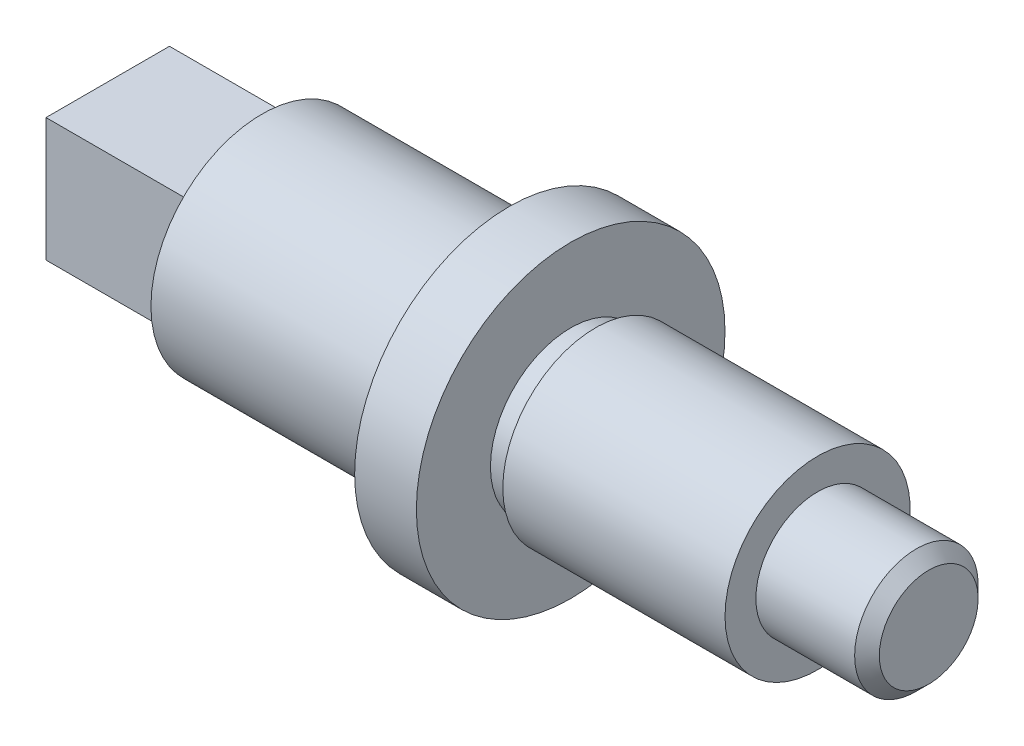
ISO-10303-21;
HEADER;
FILE_DESCRIPTION(('STEP AP214'),'2;1');
FILE_NAME('part.step','',(''),(''),'','','');
FILE_SCHEMA(('AUTOMOTIVE_DESIGN { 1 0 10303 214 1 1 1 1 }'));
ENDSEC;
DATA;
#1=APPLICATION_CONTEXT('core data for automotive mechanical design processes');
#2=APPLICATION_PROTOCOL_DEFINITION('international standard','automotive_design',2000,#1);
#3=PRODUCT_CONTEXT('',#1,'mechanical');
#4=PRODUCT('Part','Part','',(#3));
#5=PRODUCT_RELATED_PRODUCT_CATEGORY('part','',(#4));
#6=PRODUCT_DEFINITION_FORMATION('','',#4);
#7=PRODUCT_DEFINITION_CONTEXT('part definition',#1,'design');
#8=PRODUCT_DEFINITION('design','',#6,#7);
#9=PRODUCT_DEFINITION_SHAPE('','',#8);
#10=(LENGTH_UNIT() NAMED_UNIT(*) SI_UNIT(.MILLI.,.METRE.));
#11=(NAMED_UNIT(*) PLANE_ANGLE_UNIT() SI_UNIT($,.RADIAN.));
#12=(NAMED_UNIT(*) SI_UNIT($,.STERADIAN.) SOLID_ANGLE_UNIT());
#13=UNCERTAINTY_MEASURE_WITH_UNIT(LENGTH_MEASURE(1.E-05),#10,'distance_accuracy_value','');
#14=(GEOMETRIC_REPRESENTATION_CONTEXT(3) GLOBAL_UNCERTAINTY_ASSIGNED_CONTEXT((#13)) GLOBAL_UNIT_ASSIGNED_CONTEXT((#10,
#11,#12)) REPRESENTATION_CONTEXT('',''));
#15=CARTESIAN_POINT('',(0.,0.,0.));
#16=DIRECTION('',(0.,0.,1.));
#17=DIRECTION('',(1.,0.,0.));
#18=AXIS2_PLACEMENT_3D('',#15,#16,#17);
#19=CARTESIAN_POINT('',(18.1873759509063,0.,0.));
#20=DIRECTION('',(-1.,0.,0.));
#21=DIRECTION('',(0.,0.,1.));
#22=AXIS2_PLACEMENT_3D('',#19,#20,#21);
#23=PLANE('',#22);
#24=DIRECTION('',(0.,1.,0.));
#25=VECTOR('',#24,1.);
#26=CARTESIAN_POINT('',(18.1873759509063,10.,10.));
#27=LINE('',#26,#25);
#28=CARTESIAN_POINT('',(18.1873759509063,-10.,10.));
#29=VERTEX_POINT('',#28);
#30=CARTESIAN_POINT('',(18.1873759509063,10.,10.));
#31=VERTEX_POINT('',#30);
#32=EDGE_CURVE('E54',#29,#31,#27,.T.);
#33=ORIENTED_EDGE('',*,*,#32,.F.);
#34=DIRECTION('',(0.,0.,1.));
#35=VECTOR('',#34,1.);
#36=CARTESIAN_POINT('',(18.1873759509063,-10.,-9.99999999999999));
#37=LINE('',#36,#35);
#38=CARTESIAN_POINT('',(18.1873759509063,-10.,-9.99999999999999));
#39=VERTEX_POINT('',#38);
#40=EDGE_CURVE('E58',#39,#29,#37,.T.);
#41=ORIENTED_EDGE('',*,*,#40,.F.);
#42=DIRECTION('',(0.,-1.,0.));
#43=VECTOR('',#42,1.);
#44=CARTESIAN_POINT('',(18.1873759509063,10.,-10.));
#45=LINE('',#44,#43);
#46=CARTESIAN_POINT('',(18.1873759509063,10.,-10.));
#47=VERTEX_POINT('',#46);
#48=EDGE_CURVE('E327',#47,#39,#45,.T.);
#49=ORIENTED_EDGE('',*,*,#48,.F.);
#50=DIRECTION('',(0.,0.,-1.));
#51=VECTOR('',#50,1.);
#52=CARTESIAN_POINT('',(18.1873759509063,10.,-10.));
#53=LINE('',#52,#51);
#54=EDGE_CURVE('E337',#31,#47,#53,.T.);
#55=ORIENTED_EDGE('',*,*,#54,.F.);
#56=EDGE_LOOP('',(#33,#41,#49,#55));
#57=FACE_BOUND('',#56,.T.);
#58=CARTESIAN_POINT('',(18.1873759509063,0.,0.));
#59=DIRECTION('',(-1.,0.,0.));
#60=DIRECTION('',(0.,0.,1.));
#61=AXIS2_PLACEMENT_3D('',#58,#59,#60);
#62=CIRCLE('',#61,18.);
#63=CARTESIAN_POINT('',(18.1873759509063,0.,18.));
#64=VERTEX_POINT('',#63);
#65=EDGE_CURVE('E11',#64,#64,#62,.T.);
#66=ORIENTED_EDGE('',*,*,#65,.T.);
#67=EDGE_LOOP('',(#66));
#68=FACE_BOUND('',#67,.T.);
#69=ADVANCED_FACE('F39',(#57,#68),#23,.T.);
#70=CARTESIAN_POINT('',(0.,0.,0.));
#71=DIRECTION('',(-1.,0.,0.));
#72=DIRECTION('',(0.,0.,1.));
#73=AXIS2_PLACEMENT_3D('',#70,#71,#72);
#74=CYLINDRICAL_SURFACE('',#73,18.);
#75=CARTESIAN_POINT('',(54.1873759509062,0.,0.));
#76=DIRECTION('',(-1.,0.,0.));
#77=DIRECTION('',(0.,0.,1.));
#78=AXIS2_PLACEMENT_3D('',#75,#76,#77);
#79=CIRCLE('',#78,18.);
#80=CARTESIAN_POINT('',(54.1873759509062,0.,18.));
#81=VERTEX_POINT('',#80);
#82=EDGE_CURVE('E47',#81,#81,#79,.T.);
#83=ORIENTED_EDGE('',*,*,#82,.T.);
#84=EDGE_LOOP('',(#83));
#85=FACE_BOUND('',#84,.T.);
#86=ORIENTED_EDGE('',*,*,#65,.F.);
#87=EDGE_LOOP('',(#86));
#88=FACE_BOUND('',#87,.T.);
#89=ADVANCED_FACE('F152',(#85,#88),#74,.T.);
#90=CARTESIAN_POINT('',(54.1873759509063,0.,0.));
#91=DIRECTION('',(-1.,0.,0.));
#92=DIRECTION('',(0.,0.,1.));
#93=AXIS2_PLACEMENT_3D('',#90,#91,#92);
#94=TOROIDAL_SURFACE('',#93,22.,4.);
#95=CARTESIAN_POINT('',(58.1873759509063,0.,0.));
#96=DIRECTION('',(-1.,0.,0.));
#97=DIRECTION('',(0.,0.,1.));
#98=AXIS2_PLACEMENT_3D('',#95,#96,#97);
#99=CIRCLE('',#98,22.);
#100=CARTESIAN_POINT('',(58.1873759509063,0.,22.));
#101=VERTEX_POINT('',#100);
#102=EDGE_CURVE('E145',#101,#101,#99,.T.);
#103=ORIENTED_EDGE('',*,*,#102,.T.);
#104=EDGE_LOOP('',(#103));
#105=FACE_BOUND('',#104,.T.);
#106=ORIENTED_EDGE('',*,*,#82,.F.);
#107=EDGE_LOOP('',(#106));
#108=FACE_BOUND('',#107,.T.);
#109=ADVANCED_FACE('F155',(#105,#108),#94,.F.);
#110=CARTESIAN_POINT('',(58.1873759509063,-22.,0.));
#111=DIRECTION('',(-1.,0.,0.));
#112=DIRECTION('',(0.,0.,1.));
#113=AXIS2_PLACEMENT_3D('',#110,#111,#112);
#114=PLANE('',#113);
#115=CARTESIAN_POINT('',(58.1873759509063,0.,0.));
#116=DIRECTION('',(-1.,0.,0.));
#117=DIRECTION('',(0.,0.,1.));
#118=AXIS2_PLACEMENT_3D('',#115,#116,#117);
#119=CIRCLE('',#118,25.);
#120=CARTESIAN_POINT('',(58.1873759509063,0.,25.));
#121=VERTEX_POINT('',#120);
#122=EDGE_CURVE('E141',#121,#121,#119,.T.);
#123=ORIENTED_EDGE('',*,*,#122,.T.);
#124=EDGE_LOOP('',(#123));
#125=FACE_BOUND('',#124,.T.);
#126=ORIENTED_EDGE('',*,*,#102,.F.);
#127=EDGE_LOOP('',(#126));
#128=FACE_BOUND('',#127,.T.);
#129=ADVANCED_FACE('F157',(#125,#128),#114,.T.);
#130=CARTESIAN_POINT('',(0.,0.,0.));
#131=DIRECTION('',(-1.,0.,0.));
#132=DIRECTION('',(0.,0.,1.));
#133=AXIS2_PLACEMENT_3D('',#130,#131,#132);
#134=CYLINDRICAL_SURFACE('',#133,25.);
#135=CARTESIAN_POINT('',(68.1873759509063,0.,0.));
#136=DIRECTION('',(-1.,0.,0.));
#137=DIRECTION('',(0.,0.,1.));
#138=AXIS2_PLACEMENT_3D('',#135,#136,#137);
#139=CIRCLE('',#138,25.);
#140=CARTESIAN_POINT('',(68.1873759509063,0.,25.));
#141=VERTEX_POINT('',#140);
#142=EDGE_CURVE('E137',#141,#141,#139,.T.);
#143=ORIENTED_EDGE('',*,*,#142,.T.);
#144=EDGE_LOOP('',(#143));
#145=FACE_BOUND('',#144,.T.);
#146=ORIENTED_EDGE('',*,*,#122,.F.);
#147=EDGE_LOOP('',(#146));
#148=FACE_BOUND('',#147,.T.);
#149=ADVANCED_FACE('F164',(#145,#148),#134,.T.);
#150=CARTESIAN_POINT('',(68.1873759509063,-25.,0.));
#151=DIRECTION('',(1.,0.,0.));
#152=DIRECTION('',(0.,0.,-1.));
#153=AXIS2_PLACEMENT_3D('',#150,#151,#152);
#154=PLANE('',#153);
#155=CARTESIAN_POINT('',(68.1873759509063,0.,0.));
#156=DIRECTION('',(-1.,0.,0.));
#157=DIRECTION('',(0.,0.,1.));
#158=AXIS2_PLACEMENT_3D('',#155,#156,#157);
#159=CIRCLE('',#158,13.);
#160=CARTESIAN_POINT('',(68.1873759509063,0.,13.));
#161=VERTEX_POINT('',#160);
#162=EDGE_CURVE('E133',#161,#161,#159,.T.);
#163=ORIENTED_EDGE('',*,*,#162,.T.);
#164=EDGE_LOOP('',(#163));
#165=FACE_BOUND('',#164,.T.);
#166=ORIENTED_EDGE('',*,*,#142,.F.);
#167=EDGE_LOOP('',(#166));
#168=FACE_BOUND('',#167,.T.);
#169=ADVANCED_FACE('F197',(#165,#168),#154,.T.);
#170=CARTESIAN_POINT('',(0.,0.,0.));
#171=DIRECTION('',(-1.,0.,0.));
#172=DIRECTION('',(0.,0.,1.));
#173=AXIS2_PLACEMENT_3D('',#170,#171,#172);
#174=CYLINDRICAL_SURFACE('',#173,13.);
#175=CARTESIAN_POINT('',(72.1873759509063,0.,0.));
#176=DIRECTION('',(-1.,0.,0.));
#177=DIRECTION('',(0.,0.,1.));
#178=AXIS2_PLACEMENT_3D('',#175,#176,#177);
#179=CIRCLE('',#178,13.);
#180=CARTESIAN_POINT('',(72.1873759509063,0.,13.));
#181=VERTEX_POINT('',#180);
#182=EDGE_CURVE('E129',#181,#181,#179,.T.);
#183=ORIENTED_EDGE('',*,*,#182,.T.);
#184=EDGE_LOOP('',(#183));
#185=FACE_BOUND('',#184,.T.);
#186=ORIENTED_EDGE('',*,*,#162,.F.);
#187=EDGE_LOOP('',(#186));
#188=FACE_BOUND('',#187,.T.);
#189=ADVANCED_FACE('F207',(#185,#188),#174,.T.);
#190=CARTESIAN_POINT('',(72.1873759509063,-13.,0.));
#191=DIRECTION('',(-1.,0.,0.));
#192=DIRECTION('',(0.,0.,1.));
#193=AXIS2_PLACEMENT_3D('',#190,#191,#192);
#194=PLANE('',#193);
#195=CARTESIAN_POINT('',(72.1873759509063,0.,0.));
#196=DIRECTION('',(-1.,0.,0.));
#197=DIRECTION('',(0.,0.,1.));
#198=AXIS2_PLACEMENT_3D('',#195,#196,#197);
#199=CIRCLE('',#198,15.);
#200=CARTESIAN_POINT('',(72.1873759509063,0.,15.));
#201=VERTEX_POINT('',#200);
#202=EDGE_CURVE('E125',#201,#201,#199,.T.);
#203=ORIENTED_EDGE('',*,*,#202,.T.);
#204=EDGE_LOOP('',(#203));
#205=FACE_BOUND('',#204,.T.);
#206=ORIENTED_EDGE('',*,*,#182,.F.);
#207=EDGE_LOOP('',(#206));
#208=FACE_BOUND('',#207,.T.);
#209=ADVANCED_FACE('F217',(#205,#208),#194,.T.);
#210=CARTESIAN_POINT('',(0.,0.,0.));
#211=DIRECTION('',(-1.,0.,0.));
#212=DIRECTION('',(0.,0.,1.));
#213=AXIS2_PLACEMENT_3D('',#210,#211,#212);
#214=CYLINDRICAL_SURFACE('',#213,15.);
#215=CARTESIAN_POINT('',(108.187375950906,0.,0.));
#216=DIRECTION('',(-1.,0.,0.));
#217=DIRECTION('',(0.,0.,1.));
#218=AXIS2_PLACEMENT_3D('',#215,#216,#217);
#219=CIRCLE('',#218,15.);
#220=CARTESIAN_POINT('',(108.187375950906,0.,15.));
#221=VERTEX_POINT('',#220);
#222=EDGE_CURVE('E121',#221,#221,#219,.T.);
#223=ORIENTED_EDGE('',*,*,#222,.T.);
#224=EDGE_LOOP('',(#223));
#225=FACE_BOUND('',#224,.T.);
#226=ORIENTED_EDGE('',*,*,#202,.F.);
#227=EDGE_LOOP('',(#226));
#228=FACE_BOUND('',#227,.T.);
#229=ADVANCED_FACE('F227',(#225,#228),#214,.T.);
#230=CARTESIAN_POINT('',(108.187375950906,-15.,0.));
#231=DIRECTION('',(1.,0.,0.));
#232=DIRECTION('',(0.,0.,-1.));
#233=AXIS2_PLACEMENT_3D('',#230,#231,#232);
#234=PLANE('',#233);
#235=CARTESIAN_POINT('',(108.187375950906,0.,0.));
#236=DIRECTION('',(-1.,0.,0.));
#237=DIRECTION('',(0.,0.,1.));
#238=AXIS2_PLACEMENT_3D('',#235,#236,#237);
#239=CIRCLE('',#238,10.);
#240=CARTESIAN_POINT('',(108.187375950906,0.,10.));
#241=VERTEX_POINT('',#240);
#242=EDGE_CURVE('E117',#241,#241,#239,.T.);
#243=ORIENTED_EDGE('',*,*,#242,.T.);
#244=EDGE_LOOP('',(#243));
#245=FACE_BOUND('',#244,.T.);
#246=ORIENTED_EDGE('',*,*,#222,.F.);
#247=EDGE_LOOP('',(#246));
#248=FACE_BOUND('',#247,.T.);
#249=ADVANCED_FACE('F237',(#245,#248),#234,.T.);
#250=CARTESIAN_POINT('',(0.,0.,0.));
#251=DIRECTION('',(-1.,0.,0.));
#252=DIRECTION('',(0.,0.,1.));
#253=AXIS2_PLACEMENT_3D('',#250,#251,#252);
#254=CYLINDRICAL_SURFACE('',#253,10.);
#255=CARTESIAN_POINT('',(124.187375950906,0.,0.));
#256=DIRECTION('',(-1.,0.,0.));
#257=DIRECTION('',(0.,0.,1.));
#258=AXIS2_PLACEMENT_3D('',#255,#256,#257);
#259=CIRCLE('',#258,10.);
#260=CARTESIAN_POINT('',(124.187375950906,0.,10.));
#261=VERTEX_POINT('',#260);
#262=EDGE_CURVE('E108',#261,#261,#259,.T.);
#263=ORIENTED_EDGE('',*,*,#262,.T.);
#264=EDGE_LOOP('',(#263));
#265=FACE_BOUND('',#264,.T.);
#266=ORIENTED_EDGE('',*,*,#242,.F.);
#267=EDGE_LOOP('',(#266));
#268=FACE_BOUND('',#267,.T.);
#269=ADVANCED_FACE('F247',(#265,#268),#254,.T.);
#270=CARTESIAN_POINT('',(124.187375950906,0.,0.));
#271=DIRECTION('',(-1.,0.,0.));
#272=DIRECTION('',(0.,0.,1.));
#273=AXIS2_PLACEMENT_3D('',#270,#271,#272);
#274=CONICAL_SURFACE('',#273,10.,0.785398163397448);
#275=CARTESIAN_POINT('',(126.187375950906,0.,0.));
#276=DIRECTION('',(-1.,0.,0.));
#277=DIRECTION('',(0.,0.,1.));
#278=AXIS2_PLACEMENT_3D('',#275,#276,#277);
#279=CIRCLE('',#278,8.);
#280=CARTESIAN_POINT('',(126.187375950906,0.,8.));
#281=VERTEX_POINT('',#280);
#282=EDGE_CURVE('E103',#281,#281,#279,.T.);
#283=ORIENTED_EDGE('',*,*,#282,.T.);
#284=EDGE_LOOP('',(#283));
#285=FACE_BOUND('',#284,.T.);
#286=ORIENTED_EDGE('',*,*,#262,.F.);
#287=EDGE_LOOP('',(#286));
#288=FACE_BOUND('',#287,.T.);
#289=ADVANCED_FACE('F257',(#285,#288),#274,.T.);
#290=CARTESIAN_POINT('',(126.187375950906,-8.,0.));
#291=DIRECTION('',(1.,0.,0.));
#292=DIRECTION('',(0.,0.,-1.));
#293=AXIS2_PLACEMENT_3D('',#290,#291,#292);
#294=PLANE('',#293);
#295=ORIENTED_EDGE('',*,*,#282,.F.);
#296=EDGE_LOOP('',(#295));
#297=FACE_BOUND('',#296,.T.);
#298=ADVANCED_FACE('F266',(#297),#294,.T.);
#299=CARTESIAN_POINT('',(-6.81262404909373,10.,10.));
#300=DIRECTION('',(0.,0.,-1.));
#301=DIRECTION('',(-1.,0.,0.));
#302=AXIS2_PLACEMENT_3D('',#299,#300,#301);
#303=PLANE('',#302);
#304=ORIENTED_EDGE('',*,*,#32,.T.);
#305=DIRECTION('',(1.,0.,0.));
#306=VECTOR('',#305,1.);
#307=CARTESIAN_POINT('',(-6.81262404909373,10.,10.));
#308=LINE('',#307,#306);
#309=CARTESIAN_POINT('',(-6.81262404909373,10.,10.));
#310=VERTEX_POINT('',#309);
#311=EDGE_CURVE('E83',#310,#31,#308,.T.);
#312=ORIENTED_EDGE('',*,*,#311,.F.);
#313=DIRECTION('',(0.,1.,0.));
#314=VECTOR('',#313,1.);
#315=CARTESIAN_POINT('',(-6.81262404909373,10.,10.));
#316=LINE('',#315,#314);
#317=CARTESIAN_POINT('',(-6.81262404909373,-10.,10.));
#318=VERTEX_POINT('',#317);
#319=EDGE_CURVE('E90',#318,#310,#316,.T.);
#320=ORIENTED_EDGE('',*,*,#319,.F.);
#321=DIRECTION('',(1.,0.,0.));
#322=VECTOR('',#321,1.);
#323=CARTESIAN_POINT('',(-6.81262404909373,-10.,10.));
#324=LINE('',#323,#322);
#325=EDGE_CURVE('E324',#318,#29,#324,.T.);
#326=ORIENTED_EDGE('',*,*,#325,.T.);
#327=EDGE_LOOP('',(#304,#312,#320,#326));
#328=FACE_BOUND('',#327,.T.);
#329=ADVANCED_FACE('F101',(#328),#303,.F.);
#330=CARTESIAN_POINT('',(-6.81262404909373,10.,-10.));
#331=DIRECTION('',(0.,-1.,0.));
#332=DIRECTION('',(0.,0.,-1.));
#333=AXIS2_PLACEMENT_3D('',#330,#331,#332);
#334=PLANE('',#333);
#335=ORIENTED_EDGE('',*,*,#54,.T.);
#336=DIRECTION('',(1.,0.,0.));
#337=VECTOR('',#336,1.);
#338=CARTESIAN_POINT('',(-6.81262404909373,10.,-10.));
#339=LINE('',#338,#337);
#340=CARTESIAN_POINT('',(-6.81262404909373,10.,-10.));
#341=VERTEX_POINT('',#340);
#342=EDGE_CURVE('E85',#341,#47,#339,.T.);
#343=ORIENTED_EDGE('',*,*,#342,.F.);
#344=DIRECTION('',(0.,0.,-1.));
#345=VECTOR('',#344,1.);
#346=CARTESIAN_POINT('',(-6.81262404909373,10.,-10.));
#347=LINE('',#346,#345);
#348=EDGE_CURVE('E78',#310,#341,#347,.T.);
#349=ORIENTED_EDGE('',*,*,#348,.F.);
#350=ORIENTED_EDGE('',*,*,#311,.T.);
#351=EDGE_LOOP('',(#335,#343,#349,#350));
#352=FACE_BOUND('',#351,.T.);
#353=ADVANCED_FACE('F81',(#352),#334,.F.);
#354=CARTESIAN_POINT('',(-6.81262404909373,10.,-10.));
#355=DIRECTION('',(0.,0.,1.));
#356=DIRECTION('',(0.,-1.,0.));
#357=AXIS2_PLACEMENT_3D('',#354,#355,#356);
#358=PLANE('',#357);
#359=ORIENTED_EDGE('',*,*,#48,.T.);
#360=DIRECTION('',(1.,0.,0.));
#361=VECTOR('',#360,1.);
#362=CARTESIAN_POINT('',(-6.81262404909373,-10.,-9.99999999999999));
#363=LINE('',#362,#361);
#364=CARTESIAN_POINT('',(-6.81262404909373,-10.,-9.99999999999999));
#365=VERTEX_POINT('',#364);
#366=EDGE_CURVE('E110',#365,#39,#363,.T.);
#367=ORIENTED_EDGE('',*,*,#366,.F.);
#368=DIRECTION('',(0.,-1.,0.));
#369=VECTOR('',#368,1.);
#370=CARTESIAN_POINT('',(-6.81262404909373,10.,-10.));
#371=LINE('',#370,#369);
#372=EDGE_CURVE('E89',#341,#365,#371,.T.);
#373=ORIENTED_EDGE('',*,*,#372,.F.);
#374=ORIENTED_EDGE('',*,*,#342,.T.);
#375=EDGE_LOOP('',(#359,#367,#373,#374));
#376=FACE_BOUND('',#375,.T.);
#377=ADVANCED_FACE('F289',(#376),#358,.F.);
#378=CARTESIAN_POINT('',(-6.81262404909373,-10.,-9.99999999999999));
#379=DIRECTION('',(0.,1.,0.));
#380=DIRECTION('',(0.,0.,1.));
#381=AXIS2_PLACEMENT_3D('',#378,#379,#380);
#382=PLANE('',#381);
#383=ORIENTED_EDGE('',*,*,#40,.T.);
#384=ORIENTED_EDGE('',*,*,#325,.F.);
#385=DIRECTION('',(0.,0.,1.));
#386=VECTOR('',#385,1.);
#387=CARTESIAN_POINT('',(-6.81262404909373,-10.,-9.99999999999999));
#388=LINE('',#387,#386);
#389=EDGE_CURVE('E95',#365,#318,#388,.T.);
#390=ORIENTED_EDGE('',*,*,#389,.F.);
#391=ORIENTED_EDGE('',*,*,#366,.T.);
#392=EDGE_LOOP('',(#383,#384,#390,#391));
#393=FACE_BOUND('',#392,.T.);
#394=ADVANCED_FACE('F296',(#393),#382,.F.);
#395=CARTESIAN_POINT('',(-6.81262404909373,0.,0.));
#396=DIRECTION('',(-1.,0.,0.));
#397=DIRECTION('',(0.,0.,1.));
#398=AXIS2_PLACEMENT_3D('',#395,#396,#397);
#399=PLANE('',#398);
#400=ORIENTED_EDGE('',*,*,#319,.T.);
#401=ORIENTED_EDGE('',*,*,#348,.T.);
#402=ORIENTED_EDGE('',*,*,#372,.T.);
#403=ORIENTED_EDGE('',*,*,#389,.T.);
#404=EDGE_LOOP('',(#400,#401,#402,#403));
#405=FACE_BOUND('',#404,.T.);
#406=ADVANCED_FACE('F93',(#405),#399,.T.);
#407=CLOSED_SHELL('',(#69,#89,#109,#129,#149,#169,#189,#209,#229,#249,#269,#289,#298,#329,#353,
#377,#394,#406));
#408=MANIFOLD_SOLID_BREP('B2',#407);
#409=ADVANCED_BREP_SHAPE_REPRESENTATION('',(#18,#408),#14);
#410=SHAPE_DEFINITION_REPRESENTATION(#9,#409);
ENDSEC;
END-ISO-10303-21;
